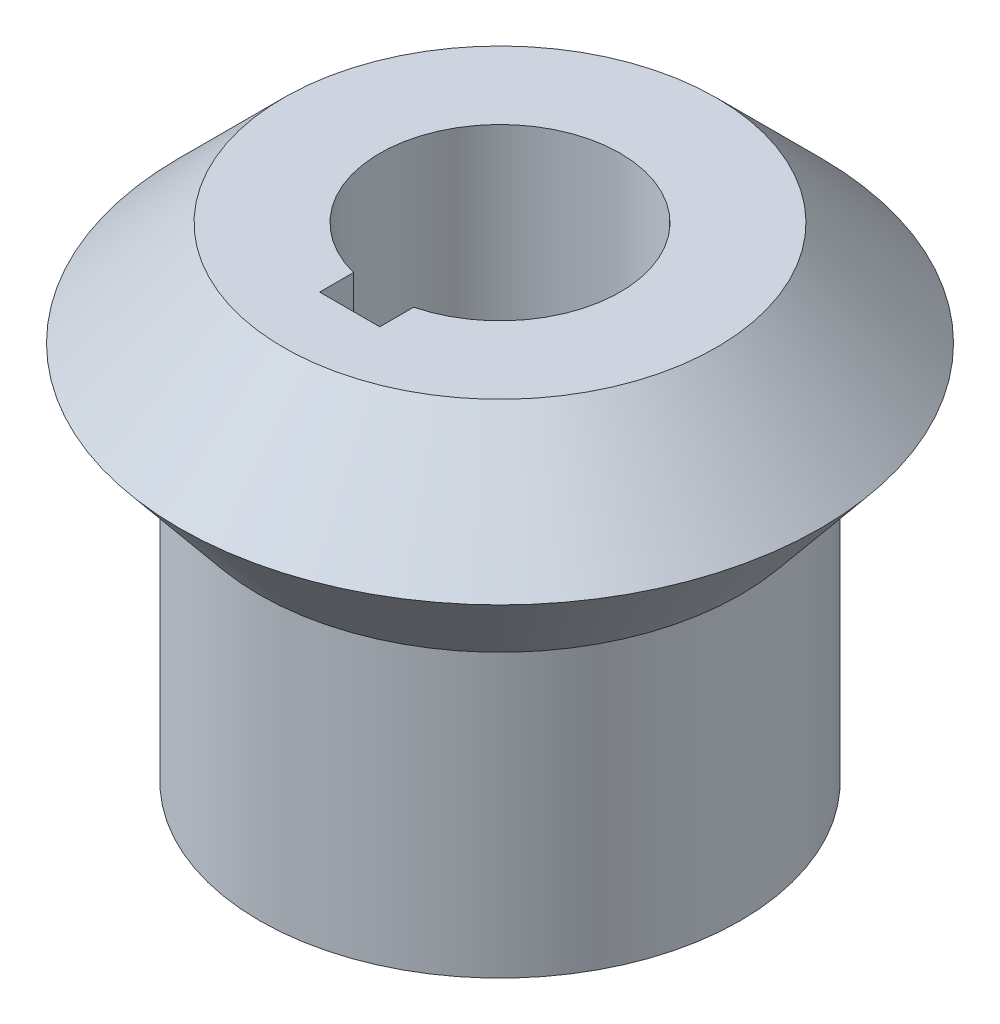
ISO-10303-21;
HEADER;
FILE_DESCRIPTION(('STEP AP214'),'2;1');
FILE_NAME('part.step','',(''),(''),'','','');
FILE_SCHEMA(('AUTOMOTIVE_DESIGN { 1 0 10303 214 1 1 1 1 }'));
ENDSEC;
DATA;
#1=APPLICATION_CONTEXT('core data for automotive mechanical design processes');
#2=APPLICATION_PROTOCOL_DEFINITION('international standard','automotive_design',2000,#1);
#3=PRODUCT_CONTEXT('',#1,'mechanical');
#4=PRODUCT('Part','Part','',(#3));
#5=PRODUCT_RELATED_PRODUCT_CATEGORY('part','',(#4));
#6=PRODUCT_DEFINITION_FORMATION('','',#4);
#7=PRODUCT_DEFINITION_CONTEXT('part definition',#1,'design');
#8=PRODUCT_DEFINITION('design','',#6,#7);
#9=PRODUCT_DEFINITION_SHAPE('','',#8);
#10=(LENGTH_UNIT() NAMED_UNIT(*) SI_UNIT(.MILLI.,.METRE.));
#11=(NAMED_UNIT(*) PLANE_ANGLE_UNIT() SI_UNIT($,.RADIAN.));
#12=(NAMED_UNIT(*) SI_UNIT($,.STERADIAN.) SOLID_ANGLE_UNIT());
#13=UNCERTAINTY_MEASURE_WITH_UNIT(LENGTH_MEASURE(1.E-05),#10,'distance_accuracy_value','');
#14=(GEOMETRIC_REPRESENTATION_CONTEXT(3) GLOBAL_UNCERTAINTY_ASSIGNED_CONTEXT((#13)) GLOBAL_UNIT_ASSIGNED_CONTEXT((#10,
#11,#12)) REPRESENTATION_CONTEXT('',''));
#15=CARTESIAN_POINT('',(0.,0.,0.));
#16=DIRECTION('',(0.,0.,1.));
#17=DIRECTION('',(1.,0.,0.));
#18=AXIS2_PLACEMENT_3D('',#15,#16,#17);
#19=CARTESIAN_POINT('',(-1.190625,19.304,5.953125));
#20=DIRECTION('',(1.,0.,0.));
#21=DIRECTION('',(0.,0.,-1.));
#22=AXIS2_PLACEMENT_3D('',#19,#20,#21);
#23=PLANE('',#22);
#24=DIRECTION('',(0.,0.,-1.));
#25=VECTOR('',#24,1.);
#26=CARTESIAN_POINT('',(-1.190625,0.,5.953125));
#27=LINE('',#26,#25);
#28=CARTESIAN_POINT('',(-1.190625,0.,5.953125));
#29=VERTEX_POINT('',#28);
#30=CARTESIAN_POINT('',(-1.190625,0.,4.61127079657821));
#31=VERTEX_POINT('',#30);
#32=EDGE_CURVE('E75',#29,#31,#27,.T.);
#33=ORIENTED_EDGE('',*,*,#32,.T.);
#34=DIRECTION('',(0.,-1.,0.));
#35=VECTOR('',#34,1.);
#36=CARTESIAN_POINT('',(-1.190625,0.,4.61127079657821));
#37=LINE('',#36,#35);
#38=CARTESIAN_POINT('',(-1.190625,19.177,4.61127079657821));
#39=VERTEX_POINT('',#38);
#40=EDGE_CURVE('E69',#31,#39,#37,.F.);
#41=ORIENTED_EDGE('',*,*,#40,.T.);
#42=DIRECTION('',(0.,0.,1.));
#43=VECTOR('',#42,1.);
#44=CARTESIAN_POINT('',(-1.190625,19.177,0.));
#45=LINE('',#44,#43);
#46=CARTESIAN_POINT('',(-1.190625,19.177,5.953125));
#47=VERTEX_POINT('',#46);
#48=EDGE_CURVE('E57',#47,#39,#45,.F.);
#49=ORIENTED_EDGE('',*,*,#48,.F.);
#50=DIRECTION('',(0.,1.,0.));
#51=VECTOR('',#50,1.);
#52=CARTESIAN_POINT('',(-1.190625,19.304,5.953125));
#53=LINE('',#52,#51);
#54=EDGE_CURVE('E96',#29,#47,#53,.T.);
#55=ORIENTED_EDGE('',*,*,#54,.F.);
#56=EDGE_LOOP('',(#33,#41,#49,#55));
#57=FACE_BOUND('',#56,.T.);
#58=ADVANCED_FACE('F17',(#57),#23,.T.);
#59=CARTESIAN_POINT('',(1.190625,19.304,3.571875));
#60=DIRECTION('',(-1.,0.,0.));
#61=DIRECTION('',(0.,0.,1.));
#62=AXIS2_PLACEMENT_3D('',#59,#60,#61);
#63=PLANE('',#62);
#64=DIRECTION('',(0.,0.,1.));
#65=VECTOR('',#64,1.);
#66=CARTESIAN_POINT('',(1.190625,19.177,0.));
#67=LINE('',#66,#65);
#68=CARTESIAN_POINT('',(1.190625,19.177,4.61127079657821));
#69=VERTEX_POINT('',#68);
#70=CARTESIAN_POINT('',(1.190625,19.177,5.953125));
#71=VERTEX_POINT('',#70);
#72=EDGE_CURVE('E48',#69,#71,#67,.T.);
#73=ORIENTED_EDGE('',*,*,#72,.F.);
#74=DIRECTION('',(0.,-1.,0.));
#75=VECTOR('',#74,1.);
#76=CARTESIAN_POINT('',(1.190625,0.,4.61127079657821));
#77=LINE('',#76,#75);
#78=CARTESIAN_POINT('',(1.190625,0.,4.61127079657821));
#79=VERTEX_POINT('',#78);
#80=EDGE_CURVE('E70',#69,#79,#77,.T.);
#81=ORIENTED_EDGE('',*,*,#80,.T.);
#82=DIRECTION('',(0.,0.,1.));
#83=VECTOR('',#82,1.);
#84=CARTESIAN_POINT('',(1.190625,0.,3.571875));
#85=LINE('',#84,#83);
#86=CARTESIAN_POINT('',(1.190625,0.,5.953125));
#87=VERTEX_POINT('',#86);
#88=EDGE_CURVE('E35',#79,#87,#85,.T.);
#89=ORIENTED_EDGE('',*,*,#88,.T.);
#90=DIRECTION('',(0.,1.,0.));
#91=VECTOR('',#90,1.);
#92=CARTESIAN_POINT('',(1.190625,19.304,5.953125));
#93=LINE('',#92,#91);
#94=EDGE_CURVE('E61',#71,#87,#93,.F.);
#95=ORIENTED_EDGE('',*,*,#94,.F.);
#96=EDGE_LOOP('',(#73,#81,#89,#95));
#97=FACE_BOUND('',#96,.T.);
#98=ADVANCED_FACE('F130',(#97),#63,.T.);
#99=CARTESIAN_POINT('',(4.7625,19.177,0.));
#100=DIRECTION('',(0.,1.,0.));
#101=DIRECTION('',(0.,0.,1.));
#102=AXIS2_PLACEMENT_3D('',#99,#100,#101);
#103=PLANE('',#102);
#104=CARTESIAN_POINT('',(0.,19.177,0.));
#105=DIRECTION('',(0.,-1.,0.));
#106=DIRECTION('',(0.,0.,-1.));
#107=AXIS2_PLACEMENT_3D('',#104,#105,#106);
#108=CIRCLE('',#107,4.7625);
#109=EDGE_CURVE('E66',#39,#69,#108,.T.);
#110=ORIENTED_EDGE('',*,*,#109,.T.);
#111=ORIENTED_EDGE('',*,*,#72,.T.);
#112=DIRECTION('',(-1.,0.,0.));
#113=VECTOR('',#112,1.);
#114=CARTESIAN_POINT('',(1.190625,19.177,5.953125));
#115=LINE('',#114,#113);
#116=EDGE_CURVE('E80',#47,#71,#115,.F.);
#117=ORIENTED_EDGE('',*,*,#116,.F.);
#118=ORIENTED_EDGE('',*,*,#48,.T.);
#119=EDGE_LOOP('',(#110,#111,#117,#118));
#120=FACE_BOUND('',#119,.T.);
#121=CARTESIAN_POINT('',(0.,19.177,0.));
#122=DIRECTION('',(0.,-1.,0.));
#123=DIRECTION('',(0.,0.,-1.));
#124=AXIS2_PLACEMENT_3D('',#121,#122,#123);
#125=CIRCLE('',#124,8.569071);
#126=CARTESIAN_POINT('',(0.,19.177,-8.569071));
#127=VERTEX_POINT('',#126);
#128=EDGE_CURVE('E20',#127,#127,#125,.T.);
#129=ORIENTED_EDGE('',*,*,#128,.F.);
#130=EDGE_LOOP('',(#129));
#131=FACE_BOUND('',#130,.T.);
#132=ADVANCED_FACE('F77',(#120,#131),#103,.T.);
#133=CARTESIAN_POINT('',(0.,15.046071,0.));
#134=DIRECTION('',(0.,-1.,0.));
#135=DIRECTION('',(0.,0.,-1.));
#136=AXIS2_PLACEMENT_3D('',#133,#134,#135);
#137=CONICAL_SURFACE('',#136,12.7,0.785398163397449);
#138=CARTESIAN_POINT('',(0.,15.046071,0.));
#139=DIRECTION('',(0.,1.,0.));
#140=DIRECTION('',(0.,0.,1.));
#141=AXIS2_PLACEMENT_3D('',#138,#139,#140);
#142=CIRCLE('',#141,12.7);
#143=CARTESIAN_POINT('',(0.,15.046071,12.7));
#144=VERTEX_POINT('',#143);
#145=EDGE_CURVE('E72',#144,#144,#142,.F.);
#146=ORIENTED_EDGE('',*,*,#145,.F.);
#147=EDGE_LOOP('',(#146));
#148=FACE_BOUND('',#147,.T.);
#149=ORIENTED_EDGE('',*,*,#128,.T.);
#150=EDGE_LOOP('',(#149));
#151=FACE_BOUND('',#150,.T.);
#152=ADVANCED_FACE('F122',(#148,#151),#137,.T.);
#153=CARTESIAN_POINT('',(1.190625,19.304,5.953125));
#154=DIRECTION('',(0.,0.,-1.));
#155=DIRECTION('',(-1.,0.,0.));
#156=AXIS2_PLACEMENT_3D('',#153,#154,#155);
#157=PLANE('',#156);
#158=ORIENTED_EDGE('',*,*,#54,.T.);
#159=ORIENTED_EDGE('',*,*,#116,.T.);
#160=ORIENTED_EDGE('',*,*,#94,.T.);
#161=DIRECTION('',(1.,0.,0.));
#162=VECTOR('',#161,1.);
#163=CARTESIAN_POINT('',(9.525,0.,5.953125));
#164=LINE('',#163,#162);
#165=EDGE_CURVE('E105',#29,#87,#164,.T.);
#166=ORIENTED_EDGE('',*,*,#165,.F.);
#167=EDGE_LOOP('',(#158,#159,#160,#166));
#168=FACE_BOUND('',#167,.T.);
#169=ADVANCED_FACE('F125',(#168),#157,.T.);
#170=CARTESIAN_POINT('',(0.,0.,0.));
#171=DIRECTION('',(0.,-1.,0.));
#172=DIRECTION('',(0.,0.,-1.));
#173=AXIS2_PLACEMENT_3D('',#170,#171,#172);
#174=CYLINDRICAL_SURFACE('',#173,4.7625);
#175=ORIENTED_EDGE('',*,*,#109,.F.);
#176=ORIENTED_EDGE('',*,*,#40,.F.);
#177=CARTESIAN_POINT('',(0.,0.,0.));
#178=DIRECTION('',(0.,-1.,0.));
#179=DIRECTION('',(0.,0.,-1.));
#180=AXIS2_PLACEMENT_3D('',#177,#178,#179);
#181=CIRCLE('',#180,4.7625);
#182=EDGE_CURVE('E107',#79,#31,#181,.F.);
#183=ORIENTED_EDGE('',*,*,#182,.F.);
#184=ORIENTED_EDGE('',*,*,#80,.F.);
#185=EDGE_LOOP('',(#175,#176,#183,#184));
#186=FACE_BOUND('',#185,.T.);
#187=ADVANCED_FACE('F67',(#186),#174,.F.);
#188=CARTESIAN_POINT('',(0.,15.046071,0.));
#189=DIRECTION('',(0.,1.,0.));
#190=DIRECTION('',(-1.,0.,0.));
#191=AXIS2_PLACEMENT_3D('',#188,#189,#190);
#192=CONICAL_SURFACE('',#191,12.7,0.687055815057342);
#193=ORIENTED_EDGE('',*,*,#145,.T.);
#194=EDGE_LOOP('',(#193));
#195=FACE_BOUND('',#194,.T.);
#196=CARTESIAN_POINT('',(0.,11.176,0.));
#197=DIRECTION('',(0.,-1.,0.));
#198=DIRECTION('',(0.,0.,-1.));
#199=AXIS2_PLACEMENT_3D('',#196,#197,#198);
#200=CIRCLE('',#199,9.525);
#201=CARTESIAN_POINT('',(0.,11.176,-9.525));
#202=VERTEX_POINT('',#201);
#203=EDGE_CURVE('E26',#202,#202,#200,.T.);
#204=ORIENTED_EDGE('',*,*,#203,.F.);
#205=EDGE_LOOP('',(#204));
#206=FACE_BOUND('',#205,.T.);
#207=ADVANCED_FACE('F119',(#195,#206),#192,.T.);
#208=CARTESIAN_POINT('',(9.525,0.,0.));
#209=DIRECTION('',(0.,-1.,0.));
#210=DIRECTION('',(0.,0.,-1.));
#211=AXIS2_PLACEMENT_3D('',#208,#209,#210);
#212=PLANE('',#211);
#213=ORIENTED_EDGE('',*,*,#88,.F.);
#214=ORIENTED_EDGE('',*,*,#182,.T.);
#215=ORIENTED_EDGE('',*,*,#32,.F.);
#216=ORIENTED_EDGE('',*,*,#165,.T.);
#217=EDGE_LOOP('',(#213,#214,#215,#216));
#218=FACE_BOUND('',#217,.T.);
#219=CARTESIAN_POINT('',(0.,0.,0.));
#220=DIRECTION('',(0.,-1.,0.));
#221=DIRECTION('',(0.,0.,-1.));
#222=AXIS2_PLACEMENT_3D('',#219,#220,#221);
#223=CIRCLE('',#222,9.525);
#224=CARTESIAN_POINT('',(0.,0.,-9.525));
#225=VERTEX_POINT('',#224);
#226=EDGE_CURVE('E11',#225,#225,#223,.F.);
#227=ORIENTED_EDGE('',*,*,#226,.F.);
#228=EDGE_LOOP('',(#227));
#229=FACE_BOUND('',#228,.T.);
#230=ADVANCED_FACE('F138',(#218,#229),#212,.T.);
#231=CARTESIAN_POINT('',(0.,0.,0.));
#232=DIRECTION('',(0.,-1.,0.));
#233=DIRECTION('',(0.,0.,-1.));
#234=AXIS2_PLACEMENT_3D('',#231,#232,#233);
#235=CYLINDRICAL_SURFACE('',#234,9.525);
#236=ORIENTED_EDGE('',*,*,#226,.T.);
#237=EDGE_LOOP('',(#236));
#238=FACE_BOUND('',#237,.T.);
#239=ORIENTED_EDGE('',*,*,#203,.T.);
#240=EDGE_LOOP('',(#239));
#241=FACE_BOUND('',#240,.T.);
#242=ADVANCED_FACE('F136',(#238,#241),#235,.T.);
#243=CLOSED_SHELL('',(#58,#98,#132,#152,#169,#187,#207,#230,#242));
#244=MANIFOLD_SOLID_BREP('B1',#243);
#245=ADVANCED_BREP_SHAPE_REPRESENTATION('',(#18,#244),#14);
#246=SHAPE_DEFINITION_REPRESENTATION(#9,#245);
ENDSEC;
END-ISO-10303-21;
